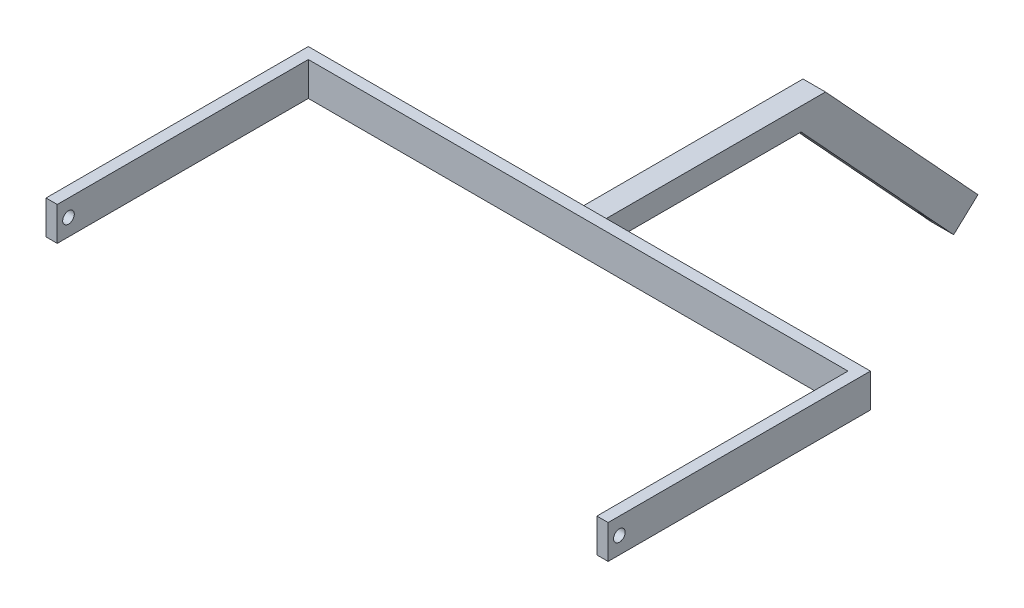
ISO-10303-21;
HEADER;
FILE_DESCRIPTION(('STEP AP214'),'2;1');
FILE_NAME('part.step','',(''),(''),'','','');
FILE_SCHEMA(('AUTOMOTIVE_DESIGN { 1 0 10303 214 1 1 1 1 }'));
ENDSEC;
DATA;
#1=APPLICATION_CONTEXT('core data for automotive mechanical design processes');
#2=APPLICATION_PROTOCOL_DEFINITION('international standard','automotive_design',2000,#1);
#3=PRODUCT_CONTEXT('',#1,'mechanical');
#4=PRODUCT('Part','Part','',(#3));
#5=PRODUCT_RELATED_PRODUCT_CATEGORY('part','',(#4));
#6=PRODUCT_DEFINITION_FORMATION('','',#4);
#7=PRODUCT_DEFINITION_CONTEXT('part definition',#1,'design');
#8=PRODUCT_DEFINITION('design','',#6,#7);
#9=PRODUCT_DEFINITION_SHAPE('','',#8);
#10=(LENGTH_UNIT() NAMED_UNIT(*) SI_UNIT(.MILLI.,.METRE.));
#11=(NAMED_UNIT(*) PLANE_ANGLE_UNIT() SI_UNIT($,.RADIAN.));
#12=(NAMED_UNIT(*) SI_UNIT($,.STERADIAN.) SOLID_ANGLE_UNIT());
#13=UNCERTAINTY_MEASURE_WITH_UNIT(LENGTH_MEASURE(1.E-05),#10,'distance_accuracy_value','');
#14=(GEOMETRIC_REPRESENTATION_CONTEXT(3) GLOBAL_UNCERTAINTY_ASSIGNED_CONTEXT((#13)) GLOBAL_UNIT_ASSIGNED_CONTEXT((#10,
#11,#12)) REPRESENTATION_CONTEXT('',''));
#15=CARTESIAN_POINT('',(0.,0.,0.));
#16=DIRECTION('',(0.,0.,1.));
#17=DIRECTION('',(1.,0.,0.));
#18=AXIS2_PLACEMENT_3D('',#15,#16,#17);
#19=CARTESIAN_POINT('',(0.,6.,-1.51515151515151));
#20=DIRECTION('',(0.,0.,1.));
#21=DIRECTION('',(1.,0.,0.));
#22=AXIS2_PLACEMENT_3D('',#19,#20,#21);
#23=PLANE('',#22);
#24=DIRECTION('',(0.,-1.,0.));
#25=VECTOR('',#24,1.);
#26=CARTESIAN_POINT('',(74.2424242424239,6.,-1.51515151515152));
#27=LINE('',#26,#25);
#28=CARTESIAN_POINT('',(74.2424242424239,7.5,-1.51515151515152));
#29=VERTEX_POINT('',#28);
#30=CARTESIAN_POINT('',(74.2424242424239,-1.5,-1.51515151515152));
#31=VERTEX_POINT('',#30);
#32=EDGE_CURVE('E314',#29,#31,#27,.T.);
#33=ORIENTED_EDGE('',*,*,#32,.T.);
#34=DIRECTION('',(1.,0.,0.));
#35=VECTOR('',#34,1.);
#36=CARTESIAN_POINT('',(-75.7575757575761,-1.5,-1.5151515151515));
#37=LINE('',#36,#35);
#38=CARTESIAN_POINT('',(-75.7575757575761,-1.5,-1.5151515151515));
#39=VERTEX_POINT('',#38);
#40=EDGE_CURVE('E252',#39,#31,#37,.T.);
#41=ORIENTED_EDGE('',*,*,#40,.F.);
#42=DIRECTION('',(0.,-1.,0.));
#43=VECTOR('',#42,1.);
#44=CARTESIAN_POINT('',(-75.7575757575761,6.,-1.5151515151515));
#45=LINE('',#44,#43);
#46=CARTESIAN_POINT('',(-75.7575757575761,7.5,-1.5151515151515));
#47=VERTEX_POINT('',#46);
#48=EDGE_CURVE('E312',#47,#39,#45,.T.);
#49=ORIENTED_EDGE('',*,*,#48,.F.);
#50=DIRECTION('',(-1.,0.,0.));
#51=VECTOR('',#50,1.);
#52=CARTESIAN_POINT('',(-75.7575757575761,7.5,-1.5151515151515));
#53=LINE('',#52,#51);
#54=EDGE_CURVE('E291',#29,#47,#53,.T.);
#55=ORIENTED_EDGE('',*,*,#54,.F.);
#56=EDGE_LOOP('',(#33,#41,#49,#55));
#57=FACE_BOUND('',#56,.T.);
#58=DIRECTION('',(0.,1.,0.));
#59=VECTOR('',#58,1.);
#60=CARTESIAN_POINT('',(-3.7575757575761,0.,-1.51515151515151));
#61=LINE('',#60,#59);
#62=CARTESIAN_POINT('',(-3.7575757575761,0.,-1.51515151515151));
#63=VERTEX_POINT('',#62);
#64=CARTESIAN_POINT('',(-3.7575757575761,6.,-1.51515151515151));
#65=VERTEX_POINT('',#64);
#66=EDGE_CURVE('E225',#63,#65,#61,.T.);
#67=ORIENTED_EDGE('',*,*,#66,.F.);
#68=DIRECTION('',(1.,0.,0.));
#69=VECTOR('',#68,1.);
#70=CARTESIAN_POINT('',(-3.7575757575761,0.,-1.51515151515151));
#71=LINE('',#70,#69);
#72=CARTESIAN_POINT('',(2.2424242424239,0.,-1.51515151515151));
#73=VERTEX_POINT('',#72);
#74=EDGE_CURVE('E229',#63,#73,#71,.T.);
#75=ORIENTED_EDGE('',*,*,#74,.T.);
#76=DIRECTION('',(0.,1.,0.));
#77=VECTOR('',#76,1.);
#78=CARTESIAN_POINT('',(2.2424242424239,0.,-1.51515151515151));
#79=LINE('',#78,#77);
#80=CARTESIAN_POINT('',(2.2424242424239,6.,-1.51515151515151));
#81=VERTEX_POINT('',#80);
#82=EDGE_CURVE('E235',#73,#81,#79,.T.);
#83=ORIENTED_EDGE('',*,*,#82,.T.);
#84=DIRECTION('',(1.,0.,0.));
#85=VECTOR('',#84,1.);
#86=CARTESIAN_POINT('',(-3.7575757575761,6.,-1.51515151515151));
#87=LINE('',#86,#85);
#88=EDGE_CURVE('E232',#65,#81,#87,.T.);
#89=ORIENTED_EDGE('',*,*,#88,.F.);
#90=EDGE_LOOP('',(#67,#75,#83,#89));
#91=FACE_BOUND('',#90,.T.);
#92=ADVANCED_FACE('F36',(#57,#91),#23,.F.);
#93=CARTESIAN_POINT('',(0.,6.,1.48484848484847));
#94=DIRECTION('',(0.,0.,1.));
#95=DIRECTION('',(1.,0.,0.));
#96=AXIS2_PLACEMENT_3D('',#93,#94,#95);
#97=PLANE('',#96);
#98=DIRECTION('',(0.,-1.,0.));
#99=VECTOR('',#98,1.);
#100=CARTESIAN_POINT('',(-72.7575757575761,6.,1.48484848484851));
#101=LINE('',#100,#99);
#102=CARTESIAN_POINT('',(-72.7575757575761,7.5,1.48484848484851));
#103=VERTEX_POINT('',#102);
#104=CARTESIAN_POINT('',(-72.7575757575761,-1.5,1.48484848484851));
#105=VERTEX_POINT('',#104);
#106=EDGE_CURVE('E306',#103,#105,#101,.T.);
#107=ORIENTED_EDGE('',*,*,#106,.T.);
#108=DIRECTION('',(-1.,0.,0.));
#109=VECTOR('',#108,1.);
#110=CARTESIAN_POINT('',(71.2424242424239,-1.5,1.48484848484846));
#111=LINE('',#110,#109);
#112=CARTESIAN_POINT('',(71.2424242424239,-1.5,1.48484848484846));
#113=VERTEX_POINT('',#112);
#114=EDGE_CURVE('E264',#113,#105,#111,.T.);
#115=ORIENTED_EDGE('',*,*,#114,.F.);
#116=DIRECTION('',(0.,-1.,0.));
#117=VECTOR('',#116,1.);
#118=CARTESIAN_POINT('',(71.2424242424239,6.,1.48484848484846));
#119=LINE('',#118,#117);
#120=CARTESIAN_POINT('',(71.2424242424239,7.5,1.48484848484846));
#121=VERTEX_POINT('',#120);
#122=EDGE_CURVE('E11',#121,#113,#119,.T.);
#123=ORIENTED_EDGE('',*,*,#122,.F.);
#124=DIRECTION('',(1.,0.,0.));
#125=VECTOR('',#124,1.);
#126=CARTESIAN_POINT('',(71.2424242424239,7.5,1.48484848484846));
#127=LINE('',#126,#125);
#128=EDGE_CURVE('E279',#103,#121,#127,.T.);
#129=ORIENTED_EDGE('',*,*,#128,.F.);
#130=EDGE_LOOP('',(#107,#115,#123,#129));
#131=FACE_BOUND('',#130,.T.);
#132=ADVANCED_FACE('F38',(#131),#97,.T.);
#133=CARTESIAN_POINT('',(71.2424242424239,6.,0.));
#134=DIRECTION('',(1.,0.,0.));
#135=DIRECTION('',(0.,0.,-1.));
#136=AXIS2_PLACEMENT_3D('',#133,#134,#135);
#137=PLANE('',#136);
#138=CARTESIAN_POINT('',(71.2424242424239,3.,65.4848484848485));
#139=DIRECTION('',(1.,0.,0.));
#140=DIRECTION('',(0.,0.,-1.));
#141=AXIS2_PLACEMENT_3D('',#138,#139,#140);
#142=CIRCLE('',#141,1.54999999999999);
#143=CARTESIAN_POINT('',(71.2424242424239,3.,63.9348484848485));
#144=VERTEX_POINT('',#143);
#145=EDGE_CURVE('E297',#144,#144,#142,.T.);
#146=ORIENTED_EDGE('',*,*,#145,.T.);
#147=EDGE_LOOP('',(#146));
#148=FACE_BOUND('',#147,.T.);
#149=ORIENTED_EDGE('',*,*,#122,.T.);
#150=DIRECTION('',(0.,0.,-1.));
#151=VECTOR('',#150,1.);
#152=CARTESIAN_POINT('',(71.2424242424239,-1.5,68.4848484848485));
#153=LINE('',#152,#151);
#154=CARTESIAN_POINT('',(71.2424242424239,-1.5,68.4848484848485));
#155=VERTEX_POINT('',#154);
#156=EDGE_CURVE('E261',#155,#113,#153,.T.);
#157=ORIENTED_EDGE('',*,*,#156,.F.);
#158=DIRECTION('',(0.,-1.,0.));
#159=VECTOR('',#158,1.);
#160=CARTESIAN_POINT('',(71.2424242424239,6.,68.4848484848485));
#161=LINE('',#160,#159);
#162=CARTESIAN_POINT('',(71.2424242424239,7.5,68.4848484848485));
#163=VERTEX_POINT('',#162);
#164=EDGE_CURVE('E45',#163,#155,#161,.T.);
#165=ORIENTED_EDGE('',*,*,#164,.F.);
#166=DIRECTION('',(0.,0.,1.));
#167=VECTOR('',#166,1.);
#168=CARTESIAN_POINT('',(71.2424242424239,7.5,68.4848484848485));
#169=LINE('',#168,#167);
#170=EDGE_CURVE('E282',#121,#163,#169,.T.);
#171=ORIENTED_EDGE('',*,*,#170,.F.);
#172=EDGE_LOOP('',(#149,#157,#165,#171));
#173=FACE_BOUND('',#172,.T.);
#174=ADVANCED_FACE('F329',(#148,#173),#137,.F.);
#175=CARTESIAN_POINT('',(0.,6.,68.4848484848485));
#176=DIRECTION('',(0.,0.,1.));
#177=DIRECTION('',(1.,0.,0.));
#178=AXIS2_PLACEMENT_3D('',#175,#176,#177);
#179=PLANE('',#178);
#180=ORIENTED_EDGE('',*,*,#164,.T.);
#181=DIRECTION('',(-1.,0.,0.));
#182=VECTOR('',#181,1.);
#183=CARTESIAN_POINT('',(74.2424242424239,-1.5,68.4848484848485));
#184=LINE('',#183,#182);
#185=CARTESIAN_POINT('',(74.2424242424239,-1.5,68.4848484848485));
#186=VERTEX_POINT('',#185);
#187=EDGE_CURVE('E258',#186,#155,#184,.T.);
#188=ORIENTED_EDGE('',*,*,#187,.F.);
#189=DIRECTION('',(0.,-1.,0.));
#190=VECTOR('',#189,1.);
#191=CARTESIAN_POINT('',(74.2424242424239,6.,68.4848484848485));
#192=LINE('',#191,#190);
#193=CARTESIAN_POINT('',(74.2424242424239,7.5,68.4848484848485));
#194=VERTEX_POINT('',#193);
#195=EDGE_CURVE('E316',#194,#186,#192,.T.);
#196=ORIENTED_EDGE('',*,*,#195,.F.);
#197=DIRECTION('',(1.,0.,0.));
#198=VECTOR('',#197,1.);
#199=CARTESIAN_POINT('',(74.2424242424239,7.5,68.4848484848485));
#200=LINE('',#199,#198);
#201=EDGE_CURVE('E285',#163,#194,#200,.T.);
#202=ORIENTED_EDGE('',*,*,#201,.F.);
#203=EDGE_LOOP('',(#180,#188,#196,#202));
#204=FACE_BOUND('',#203,.T.);
#205=ADVANCED_FACE('F321',(#204),#179,.T.);
#206=CARTESIAN_POINT('',(74.2424242424239,6.,0.));
#207=DIRECTION('',(1.,0.,0.));
#208=DIRECTION('',(0.,0.,-1.));
#209=AXIS2_PLACEMENT_3D('',#206,#207,#208);
#210=PLANE('',#209);
#211=CARTESIAN_POINT('',(74.2424242424239,3.,65.4848484848485));
#212=DIRECTION('',(1.,0.,0.));
#213=DIRECTION('',(0.,0.,-1.));
#214=AXIS2_PLACEMENT_3D('',#211,#212,#213);
#215=CIRCLE('',#214,1.54999999999999);
#216=CARTESIAN_POINT('',(74.2424242424239,3.,63.9348484848485));
#217=VERTEX_POINT('',#216);
#218=EDGE_CURVE('E294',#217,#217,#215,.T.);
#219=ORIENTED_EDGE('',*,*,#218,.F.);
#220=EDGE_LOOP('',(#219));
#221=FACE_BOUND('',#220,.T.);
#222=ORIENTED_EDGE('',*,*,#195,.T.);
#223=DIRECTION('',(0.,0.,1.));
#224=VECTOR('',#223,1.);
#225=CARTESIAN_POINT('',(74.2424242424239,-1.5,-1.51515151515152));
#226=LINE('',#225,#224);
#227=EDGE_CURVE('E255',#31,#186,#226,.T.);
#228=ORIENTED_EDGE('',*,*,#227,.F.);
#229=ORIENTED_EDGE('',*,*,#32,.F.);
#230=DIRECTION('',(0.,0.,-1.));
#231=VECTOR('',#230,1.);
#232=CARTESIAN_POINT('',(74.2424242424239,7.5,-1.51515151515152));
#233=LINE('',#232,#231);
#234=EDGE_CURVE('E288',#194,#29,#233,.T.);
#235=ORIENTED_EDGE('',*,*,#234,.F.);
#236=EDGE_LOOP('',(#222,#228,#229,#235));
#237=FACE_BOUND('',#236,.T.);
#238=ADVANCED_FACE('F352',(#221,#237),#210,.T.);
#239=CARTESIAN_POINT('',(-75.7575757575761,6.,0.));
#240=DIRECTION('',(-1.,0.,0.));
#241=DIRECTION('',(0.,0.,1.));
#242=AXIS2_PLACEMENT_3D('',#239,#240,#241);
#243=PLANE('',#242);
#244=CARTESIAN_POINT('',(-75.7575757575761,3.,65.4848484848485));
#245=DIRECTION('',(-1.,0.,0.));
#246=DIRECTION('',(0.,0.,1.));
#247=AXIS2_PLACEMENT_3D('',#244,#245,#246);
#248=CIRCLE('',#247,1.54999999999999);
#249=CARTESIAN_POINT('',(-75.7575757575761,3.,67.0348484848485));
#250=VERTEX_POINT('',#249);
#251=EDGE_CURVE('E303',#250,#250,#248,.T.);
#252=ORIENTED_EDGE('',*,*,#251,.F.);
#253=EDGE_LOOP('',(#252));
#254=FACE_BOUND('',#253,.T.);
#255=ORIENTED_EDGE('',*,*,#48,.T.);
#256=DIRECTION('',(0.,0.,-1.));
#257=VECTOR('',#256,1.);
#258=CARTESIAN_POINT('',(-75.7575757575761,-1.5,68.4848484848485));
#259=LINE('',#258,#257);
#260=CARTESIAN_POINT('',(-75.7575757575761,-1.5,68.4848484848485));
#261=VERTEX_POINT('',#260);
#262=EDGE_CURVE('E249',#261,#39,#259,.T.);
#263=ORIENTED_EDGE('',*,*,#262,.F.);
#264=DIRECTION('',(0.,-1.,0.));
#265=VECTOR('',#264,1.);
#266=CARTESIAN_POINT('',(-75.7575757575761,6.,68.4848484848485));
#267=LINE('',#266,#265);
#268=CARTESIAN_POINT('',(-75.7575757575761,7.5,68.4848484848485));
#269=VERTEX_POINT('',#268);
#270=EDGE_CURVE('E310',#269,#261,#267,.T.);
#271=ORIENTED_EDGE('',*,*,#270,.F.);
#272=DIRECTION('',(0.,0.,1.));
#273=VECTOR('',#272,1.);
#274=CARTESIAN_POINT('',(-75.7575757575761,7.5,68.4848484848485));
#275=LINE('',#274,#273);
#276=EDGE_CURVE('E270',#47,#269,#275,.T.);
#277=ORIENTED_EDGE('',*,*,#276,.F.);
#278=EDGE_LOOP('',(#255,#263,#271,#277));
#279=FACE_BOUND('',#278,.T.);
#280=ADVANCED_FACE('F345',(#254,#279),#243,.T.);
#281=CARTESIAN_POINT('',(-3.16806065107685E-13,6.,68.4848484848488));
#282=DIRECTION('',(0.,0.,-1.));
#283=DIRECTION('',(-1.,0.,0.));
#284=AXIS2_PLACEMENT_3D('',#281,#282,#283);
#285=PLANE('',#284);
#286=ORIENTED_EDGE('',*,*,#270,.T.);
#287=DIRECTION('',(-1.,0.,0.));
#288=VECTOR('',#287,1.);
#289=CARTESIAN_POINT('',(-72.7575757575761,-1.5,68.4848484848485));
#290=LINE('',#289,#288);
#291=CARTESIAN_POINT('',(-72.7575757575761,-1.5,68.4848484848485));
#292=VERTEX_POINT('',#291);
#293=EDGE_CURVE('E246',#292,#261,#290,.T.);
#294=ORIENTED_EDGE('',*,*,#293,.F.);
#295=DIRECTION('',(0.,-1.,0.));
#296=VECTOR('',#295,1.);
#297=CARTESIAN_POINT('',(-72.7575757575761,6.,68.4848484848485));
#298=LINE('',#297,#296);
#299=CARTESIAN_POINT('',(-72.7575757575761,7.5,68.4848484848485));
#300=VERTEX_POINT('',#299);
#301=EDGE_CURVE('E308',#300,#292,#298,.T.);
#302=ORIENTED_EDGE('',*,*,#301,.F.);
#303=DIRECTION('',(1.,0.,0.));
#304=VECTOR('',#303,1.);
#305=CARTESIAN_POINT('',(-72.7575757575761,7.5,68.4848484848485));
#306=LINE('',#305,#304);
#307=EDGE_CURVE('E273',#269,#300,#306,.T.);
#308=ORIENTED_EDGE('',*,*,#307,.F.);
#309=EDGE_LOOP('',(#286,#294,#302,#308));
#310=FACE_BOUND('',#309,.T.);
#311=ADVANCED_FACE('F341',(#310),#285,.F.);
#312=CARTESIAN_POINT('',(-72.7575757575761,6.,0.));
#313=DIRECTION('',(1.,0.,0.));
#314=DIRECTION('',(0.,0.,-1.));
#315=AXIS2_PLACEMENT_3D('',#312,#313,#314);
#316=PLANE('',#315);
#317=CARTESIAN_POINT('',(-72.7575757575761,3.,65.4848484848485));
#318=DIRECTION('',(1.,0.,0.));
#319=DIRECTION('',(0.,0.,-1.));
#320=AXIS2_PLACEMENT_3D('',#317,#318,#319);
#321=CIRCLE('',#320,1.54999999999999);
#322=CARTESIAN_POINT('',(-72.7575757575761,3.,63.9348484848485));
#323=VERTEX_POINT('',#322);
#324=EDGE_CURVE('E300',#323,#323,#321,.T.);
#325=ORIENTED_EDGE('',*,*,#324,.F.);
#326=EDGE_LOOP('',(#325));
#327=FACE_BOUND('',#326,.T.);
#328=ORIENTED_EDGE('',*,*,#301,.T.);
#329=DIRECTION('',(0.,0.,1.));
#330=VECTOR('',#329,1.);
#331=CARTESIAN_POINT('',(-72.7575757575761,-1.5,1.48484848484851));
#332=LINE('',#331,#330);
#333=EDGE_CURVE('E267',#105,#292,#332,.T.);
#334=ORIENTED_EDGE('',*,*,#333,.F.);
#335=ORIENTED_EDGE('',*,*,#106,.F.);
#336=DIRECTION('',(0.,0.,-1.));
#337=VECTOR('',#336,1.);
#338=CARTESIAN_POINT('',(-72.7575757575761,7.5,1.48484848484851));
#339=LINE('',#338,#337);
#340=EDGE_CURVE('E276',#300,#103,#339,.T.);
#341=ORIENTED_EDGE('',*,*,#340,.F.);
#342=EDGE_LOOP('',(#328,#334,#335,#341));
#343=FACE_BOUND('',#342,.T.);
#344=ADVANCED_FACE('F337',(#327,#343),#316,.T.);
#345=CARTESIAN_POINT('',(-82.7575757575761,3.,65.4848484848485));
#346=DIRECTION('',(1.,0.,0.));
#347=DIRECTION('',(0.,0.,-1.));
#348=AXIS2_PLACEMENT_3D('',#345,#346,#347);
#349=CYLINDRICAL_SURFACE('',#348,1.54999999999999);
#350=ORIENTED_EDGE('',*,*,#251,.T.);
#351=EDGE_LOOP('',(#350));
#352=FACE_BOUND('',#351,.T.);
#353=ORIENTED_EDGE('',*,*,#324,.T.);
#354=EDGE_LOOP('',(#353));
#355=FACE_BOUND('',#354,.T.);
#356=ADVANCED_FACE('F374',(#352,#355),#349,.F.);
#357=CARTESIAN_POINT('',(64.2424242424239,3.,65.4848484848485));
#358=DIRECTION('',(1.,0.,0.));
#359=DIRECTION('',(0.,0.,-1.));
#360=AXIS2_PLACEMENT_3D('',#357,#358,#359);
#361=CYLINDRICAL_SURFACE('',#360,1.54999999999999);
#362=ORIENTED_EDGE('',*,*,#218,.T.);
#363=EDGE_LOOP('',(#362));
#364=FACE_BOUND('',#363,.T.);
#365=ORIENTED_EDGE('',*,*,#145,.F.);
#366=EDGE_LOOP('',(#365));
#367=FACE_BOUND('',#366,.T.);
#368=ADVANCED_FACE('F378',(#364,#367),#361,.F.);
#369=CARTESIAN_POINT('',(0.,7.5,0.));
#370=DIRECTION('',(0.,-1.,0.));
#371=DIRECTION('',(0.,0.,-1.));
#372=AXIS2_PLACEMENT_3D('',#369,#370,#371);
#373=PLANE('',#372);
#374=ORIENTED_EDGE('',*,*,#276,.T.);
#375=ORIENTED_EDGE('',*,*,#307,.T.);
#376=ORIENTED_EDGE('',*,*,#340,.T.);
#377=ORIENTED_EDGE('',*,*,#128,.T.);
#378=ORIENTED_EDGE('',*,*,#170,.T.);
#379=ORIENTED_EDGE('',*,*,#201,.T.);
#380=ORIENTED_EDGE('',*,*,#234,.T.);
#381=ORIENTED_EDGE('',*,*,#54,.T.);
#382=EDGE_LOOP('',(#374,#375,#376,#377,#378,#379,#380,#381));
#383=FACE_BOUND('',#382,.T.);
#384=ADVANCED_FACE('F333',(#383),#373,.F.);
#385=CARTESIAN_POINT('',(0.,-1.5,0.));
#386=DIRECTION('',(0.,-1.,0.));
#387=DIRECTION('',(0.,0.,-1.));
#388=AXIS2_PLACEMENT_3D('',#385,#386,#387);
#389=PLANE('',#388);
#390=ORIENTED_EDGE('',*,*,#293,.T.);
#391=ORIENTED_EDGE('',*,*,#262,.T.);
#392=ORIENTED_EDGE('',*,*,#40,.T.);
#393=ORIENTED_EDGE('',*,*,#227,.T.);
#394=ORIENTED_EDGE('',*,*,#187,.T.);
#395=ORIENTED_EDGE('',*,*,#156,.T.);
#396=ORIENTED_EDGE('',*,*,#114,.T.);
#397=ORIENTED_EDGE('',*,*,#333,.T.);
#398=EDGE_LOOP('',(#390,#391,#392,#393,#394,#395,#396,#397));
#399=FACE_BOUND('',#398,.T.);
#400=ADVANCED_FACE('F326',(#399),#389,.T.);
#401=CARTESIAN_POINT('',(-3.7575757575761,0.,-61.5151515151515));
#402=DIRECTION('',(1.,0.,0.));
#403=DIRECTION('',(0.,0.,-1.));
#404=AXIS2_PLACEMENT_3D('',#401,#402,#403);
#405=PLANE('',#404);
#406=DIRECTION('',(0.,0.,1.));
#407=VECTOR('',#406,1.);
#408=CARTESIAN_POINT('',(-3.7575757575761,6.,-61.5151515151515));
#409=LINE('',#408,#407);
#410=CARTESIAN_POINT('',(-3.7575757575761,5.99999999999999,-61.5151515151515));
#411=VERTEX_POINT('',#410);
#412=EDGE_CURVE('E244',#411,#65,#409,.T.);
#413=ORIENTED_EDGE('',*,*,#412,.F.);
#414=DIRECTION('',(0.,0.734803444627488,0.678280102733066));
#415=VECTOR('',#414,1.);
#416=CARTESIAN_POINT('',(-3.75757575757611,-38.0882066776493,-102.211957679135));
#417=LINE('',#416,#415);
#418=CARTESIAN_POINT('',(-3.75757575757611,-38.0882066776493,-102.211957679135));
#419=VERTEX_POINT('',#418);
#420=EDGE_CURVE('E218',#419,#411,#417,.T.);
#421=ORIENTED_EDGE('',*,*,#420,.F.);
#422=DIRECTION('',(0.,0.678280102733066,-0.734803444627488));
#423=VECTOR('',#422,1.);
#424=CARTESIAN_POINT('',(-3.75757575757611,-44.0882066776493,-95.7119576791355));
#425=LINE('',#424,#423);
#426=CARTESIAN_POINT('',(-3.75757575757611,-44.0882066776493,-95.7119576791355));
#427=VERTEX_POINT('',#426);
#428=EDGE_CURVE('E207',#427,#419,#425,.T.);
#429=ORIENTED_EDGE('',*,*,#428,.F.);
#430=DIRECTION('',(0.,0.734803444627488,0.678280102733066));
#431=VECTOR('',#430,1.);
#432=CARTESIAN_POINT('',(-3.75757575757611,-44.0882066776493,-95.7119576791355));
#433=LINE('',#432,#431);
#434=CARTESIAN_POINT('',(-3.75757575757611,0.,-55.0151515151515));
#435=VERTEX_POINT('',#434);
#436=EDGE_CURVE('E220',#427,#435,#433,.T.);
#437=ORIENTED_EDGE('',*,*,#436,.T.);
#438=DIRECTION('',(0.,0.,1.));
#439=VECTOR('',#438,1.);
#440=CARTESIAN_POINT('',(-3.7575757575761,0.,-61.5151515151515));
#441=LINE('',#440,#439);
#442=EDGE_CURVE('E228',#435,#63,#441,.T.);
#443=ORIENTED_EDGE('',*,*,#442,.T.);
#444=ORIENTED_EDGE('',*,*,#66,.T.);
#445=EDGE_LOOP('',(#413,#421,#429,#437,#443,#444));
#446=FACE_BOUND('',#445,.T.);
#447=ADVANCED_FACE('F387',(#446),#405,.F.);
#448=CARTESIAN_POINT('',(-3.7575757575761,6.,-61.5151515151515));
#449=DIRECTION('',(0.,-1.,0.));
#450=DIRECTION('',(1.,0.,0.));
#451=AXIS2_PLACEMENT_3D('',#448,#449,#450);
#452=PLANE('',#451);
#453=ORIENTED_EDGE('',*,*,#88,.T.);
#454=DIRECTION('',(0.,0.,1.));
#455=VECTOR('',#454,1.);
#456=CARTESIAN_POINT('',(2.2424242424239,6.,-61.5151515151515));
#457=LINE('',#456,#455);
#458=CARTESIAN_POINT('',(2.2424242424239,5.99999999999999,-61.5151515151515));
#459=VERTEX_POINT('',#458);
#460=EDGE_CURVE('E242',#459,#81,#457,.T.);
#461=ORIENTED_EDGE('',*,*,#460,.F.);
#462=DIRECTION('',(1.,0.,0.));
#463=VECTOR('',#462,1.);
#464=CARTESIAN_POINT('',(-3.7575757575761,6.,-61.5151515151515));
#465=LINE('',#464,#463);
#466=EDGE_CURVE('E226',#411,#459,#465,.T.);
#467=ORIENTED_EDGE('',*,*,#466,.F.);
#468=ORIENTED_EDGE('',*,*,#412,.T.);
#469=EDGE_LOOP('',(#453,#461,#467,#468));
#470=FACE_BOUND('',#469,.T.);
#471=ADVANCED_FACE('F390',(#470),#452,.F.);
#472=CARTESIAN_POINT('',(2.2424242424239,0.,-61.5151515151515));
#473=DIRECTION('',(1.,0.,0.));
#474=DIRECTION('',(0.,0.,-1.));
#475=AXIS2_PLACEMENT_3D('',#472,#473,#474);
#476=PLANE('',#475);
#477=DIRECTION('',(0.,0.,1.));
#478=VECTOR('',#477,1.);
#479=CARTESIAN_POINT('',(2.2424242424239,0.,-61.5151515151515));
#480=LINE('',#479,#478);
#481=CARTESIAN_POINT('',(2.2424242424239,0.,-55.0151515151515));
#482=VERTEX_POINT('',#481);
#483=EDGE_CURVE('E60',#482,#73,#480,.T.);
#484=ORIENTED_EDGE('',*,*,#483,.F.);
#485=DIRECTION('',(0.,0.734803444627488,0.678280102733066));
#486=VECTOR('',#485,1.);
#487=CARTESIAN_POINT('',(2.24242424242389,-44.0882066776493,-95.7119576791355));
#488=LINE('',#487,#486);
#489=CARTESIAN_POINT('',(2.24242424242389,-44.0882066776493,-95.7119576791355));
#490=VERTEX_POINT('',#489);
#491=EDGE_CURVE('E213',#490,#482,#488,.T.);
#492=ORIENTED_EDGE('',*,*,#491,.F.);
#493=DIRECTION('',(0.,-0.678280102733066,0.734803444627488));
#494=VECTOR('',#493,1.);
#495=CARTESIAN_POINT('',(2.24242424242389,-38.0882066776493,-102.211957679135));
#496=LINE('',#495,#494);
#497=CARTESIAN_POINT('',(2.24242424242389,-38.0882066776493,-102.211957679135));
#498=VERTEX_POINT('',#497);
#499=EDGE_CURVE('E211',#498,#490,#496,.T.);
#500=ORIENTED_EDGE('',*,*,#499,.F.);
#501=DIRECTION('',(0.,0.734803444627488,0.678280102733066));
#502=VECTOR('',#501,1.);
#503=CARTESIAN_POINT('',(2.24242424242389,-38.0882066776493,-102.211957679135));
#504=LINE('',#503,#502);
#505=EDGE_CURVE('E215',#498,#459,#504,.T.);
#506=ORIENTED_EDGE('',*,*,#505,.T.);
#507=ORIENTED_EDGE('',*,*,#460,.T.);
#508=ORIENTED_EDGE('',*,*,#82,.F.);
#509=EDGE_LOOP('',(#484,#492,#500,#506,#507,#508));
#510=FACE_BOUND('',#509,.T.);
#511=ADVANCED_FACE('F394',(#510),#476,.T.);
#512=CARTESIAN_POINT('',(-3.7575757575761,0.,-61.5151515151515));
#513=DIRECTION('',(0.,-1.,0.));
#514=DIRECTION('',(1.,0.,0.));
#515=AXIS2_PLACEMENT_3D('',#512,#513,#514);
#516=PLANE('',#515);
#517=DIRECTION('',(1.,0.,0.));
#518=VECTOR('',#517,1.);
#519=CARTESIAN_POINT('',(-57.7575757575761,0.,-55.0151515151515));
#520=LINE('',#519,#518);
#521=EDGE_CURVE('E223',#435,#482,#520,.T.);
#522=ORIENTED_EDGE('',*,*,#521,.T.);
#523=ORIENTED_EDGE('',*,*,#483,.T.);
#524=ORIENTED_EDGE('',*,*,#74,.F.);
#525=ORIENTED_EDGE('',*,*,#442,.F.);
#526=EDGE_LOOP('',(#522,#523,#524,#525));
#527=FACE_BOUND('',#526,.T.);
#528=ADVANCED_FACE('F398',(#527),#516,.T.);
#529=CARTESIAN_POINT('',(2.24242424242389,-44.0882066776493,-95.7119576791355));
#530=DIRECTION('',(0.,0.678280102733066,-0.734803444627488));
#531=DIRECTION('',(0.,0.734803444627488,0.678280102733066));
#532=AXIS2_PLACEMENT_3D('',#529,#530,#531);
#533=PLANE('',#532);
#534=CARTESIAN_POINT('',(-0.757575757576109,-38.9445825652569,-90.963996960004));
#535=DIRECTION('',(0.,0.678280102733066,-0.734803444627488));
#536=DIRECTION('',(0.,0.734803444627488,0.678280102733066));
#537=AXIS2_PLACEMENT_3D('',#534,#535,#536);
#538=CIRCLE('',#537,1.55);
#539=CARTESIAN_POINT('',(-0.757575757576109,-37.8056372260843,-89.9126628007678));
#540=VERTEX_POINT('',#539);
#541=EDGE_CURVE('E189',#540,#540,#538,.T.);
#542=ORIENTED_EDGE('',*,*,#541,.T.);
#543=EDGE_LOOP('',(#542));
#544=FACE_BOUND('',#543,.T.);
#545=ORIENTED_EDGE('',*,*,#521,.F.);
#546=ORIENTED_EDGE('',*,*,#436,.F.);
#547=DIRECTION('',(-1.,0.,0.));
#548=VECTOR('',#547,1.);
#549=CARTESIAN_POINT('',(2.24242424242389,-44.0882066776493,-95.7119576791355));
#550=LINE('',#549,#548);
#551=EDGE_CURVE('E201',#490,#427,#550,.T.);
#552=ORIENTED_EDGE('',*,*,#551,.F.);
#553=ORIENTED_EDGE('',*,*,#491,.T.);
#554=EDGE_LOOP('',(#545,#546,#552,#553));
#555=FACE_BOUND('',#554,.T.);
#556=ADVANCED_FACE('F402',(#544,#555),#533,.F.);
#557=CARTESIAN_POINT('',(-3.75757575757611,-38.0882066776493,-102.211957679135));
#558=DIRECTION('',(0.,-0.678280102733066,0.734803444627488));
#559=DIRECTION('',(0.,-0.734803444627488,-0.678280102733066));
#560=AXIS2_PLACEMENT_3D('',#557,#558,#559);
#561=PLANE('',#560);
#562=CARTESIAN_POINT('',(-0.757575757576109,-32.9445825652569,-97.463996960004));
#563=DIRECTION('',(0.,0.678280102733066,-0.734803444627488));
#564=DIRECTION('',(0.,0.734803444627488,0.678280102733066));
#565=AXIS2_PLACEMENT_3D('',#562,#563,#564);
#566=CIRCLE('',#565,1.55);
#567=CARTESIAN_POINT('',(-0.757575757576109,-31.8056372260842,-96.4126628007678));
#568=VERTEX_POINT('',#567);
#569=EDGE_CURVE('E444',#568,#568,#566,.T.);
#570=ORIENTED_EDGE('',*,*,#569,.F.);
#571=EDGE_LOOP('',(#570));
#572=FACE_BOUND('',#571,.T.);
#573=ORIENTED_EDGE('',*,*,#466,.T.);
#574=ORIENTED_EDGE('',*,*,#505,.F.);
#575=DIRECTION('',(1.,0.,0.));
#576=VECTOR('',#575,1.);
#577=CARTESIAN_POINT('',(-3.75757575757611,-38.0882066776493,-102.211957679135));
#578=LINE('',#577,#576);
#579=EDGE_CURVE('E209',#419,#498,#578,.T.);
#580=ORIENTED_EDGE('',*,*,#579,.F.);
#581=ORIENTED_EDGE('',*,*,#420,.T.);
#582=EDGE_LOOP('',(#573,#574,#580,#581));
#583=FACE_BOUND('',#582,.T.);
#584=ADVANCED_FACE('F405',(#572,#583),#561,.F.);
#585=CARTESIAN_POINT('',(0.,-71.5078988066066,-66.0072912060984));
#586=DIRECTION('',(0.,-0.734803444627488,-0.678280102733066));
#587=DIRECTION('',(0.,0.678280102733066,-0.734803444627488));
#588=AXIS2_PLACEMENT_3D('',#585,#586,#587);
#589=PLANE('',#588);
#590=DIRECTION('',(0.,0.678280102733068,-0.734803444627486));
#591=VECTOR('',#590,1.);
#592=CARTESIAN_POINT('',(-3.25757575757612,-40.4099265749162,-99.696761123763));
#593=LINE('',#592,#591);
#594=CARTESIAN_POINT('',(-3.25757575757612,-41.7664867803824,-98.227154234508));
#595=VERTEX_POINT('',#594);
#596=CARTESIAN_POINT('',(-3.25757575757612,-40.4099265749162,-99.696761123763));
#597=VERTEX_POINT('',#596);
#598=EDGE_CURVE('E52',#595,#597,#593,.T.);
#599=ORIENTED_EDGE('',*,*,#598,.F.);
#600=DIRECTION('',(-1.,0.,0.));
#601=VECTOR('',#600,1.);
#602=CARTESIAN_POINT('',(1.74242424242388,-41.7664867803824,-98.227154234508));
#603=LINE('',#602,#601);
#604=CARTESIAN_POINT('',(1.74242424242388,-41.7664867803824,-98.227154234508));
#605=VERTEX_POINT('',#604);
#606=EDGE_CURVE('E183',#605,#595,#603,.T.);
#607=ORIENTED_EDGE('',*,*,#606,.F.);
#608=DIRECTION('',(0.,-0.678280102733068,0.734803444627486));
#609=VECTOR('',#608,1.);
#610=CARTESIAN_POINT('',(1.74242424242388,-40.4099265749162,-99.696761123763));
#611=LINE('',#610,#609);
#612=CARTESIAN_POINT('',(1.74242424242388,-40.4099265749162,-99.696761123763));
#613=VERTEX_POINT('',#612);
#614=EDGE_CURVE('E186',#613,#605,#611,.T.);
#615=ORIENTED_EDGE('',*,*,#614,.F.);
#616=DIRECTION('',(1.,0.,0.));
#617=VECTOR('',#616,1.);
#618=CARTESIAN_POINT('',(1.74242424242388,-40.4099265749162,-99.696761123763));
#619=LINE('',#618,#617);
#620=EDGE_CURVE('E195',#597,#613,#619,.T.);
#621=ORIENTED_EDGE('',*,*,#620,.F.);
#622=EDGE_LOOP('',(#599,#607,#615,#621));
#623=FACE_BOUND('',#622,.T.);
#624=ORIENTED_EDGE('',*,*,#551,.T.);
#625=ORIENTED_EDGE('',*,*,#428,.T.);
#626=ORIENTED_EDGE('',*,*,#579,.T.);
#627=ORIENTED_EDGE('',*,*,#499,.T.);
#628=EDGE_LOOP('',(#624,#625,#626,#627));
#629=FACE_BOUND('',#628,.T.);
#630=ADVANCED_FACE('F409',(#623,#629),#589,.T.);
#631=CARTESIAN_POINT('',(-3.25757575757612,-33.0618921286413,-92.9139600964323));
#632=DIRECTION('',(-1.,0.,0.));
#633=DIRECTION('',(0.,0.,1.));
#634=AXIS2_PLACEMENT_3D('',#631,#632,#633);
#635=PLANE('',#634);
#636=ORIENTED_EDGE('',*,*,#598,.T.);
#637=DIRECTION('',(0.,-0.734803444627488,-0.678280102733066));
#638=VECTOR('',#637,1.);
#639=CARTESIAN_POINT('',(-3.25757575757612,-33.0618921286413,-92.9139600964323));
#640=LINE('',#639,#638);
#641=CARTESIAN_POINT('',(-3.25757575757612,-33.0618921286413,-92.9139600964323));
#642=VERTEX_POINT('',#641);
#643=EDGE_CURVE('E161',#642,#597,#640,.T.);
#644=ORIENTED_EDGE('',*,*,#643,.F.);
#645=DIRECTION('',(0.,0.678280102733068,-0.734803444627486));
#646=VECTOR('',#645,1.);
#647=CARTESIAN_POINT('',(-3.25757575757612,-33.0618921286413,-92.9139600964323));
#648=LINE('',#647,#646);
#649=CARTESIAN_POINT('',(-3.25757575757612,-34.4184523341075,-91.4443532071774));
#650=VERTEX_POINT('',#649);
#651=EDGE_CURVE('E165',#650,#642,#648,.T.);
#652=ORIENTED_EDGE('',*,*,#651,.F.);
#653=DIRECTION('',(0.,-0.734803444627488,-0.678280102733066));
#654=VECTOR('',#653,1.);
#655=CARTESIAN_POINT('',(-3.25757575757612,-34.4184523341075,-91.4443532071774));
#656=LINE('',#655,#654);
#657=EDGE_CURVE('E199',#650,#595,#656,.T.);
#658=ORIENTED_EDGE('',*,*,#657,.T.);
#659=EDGE_LOOP('',(#636,#644,#652,#658));
#660=FACE_BOUND('',#659,.T.);
#661=ADVANCED_FACE('F163',(#660),#635,.F.);
#662=CARTESIAN_POINT('',(1.74242424242388,-34.4184523341075,-91.4443532071774));
#663=DIRECTION('',(0.,-0.678280102733066,0.734803444627488));
#664=DIRECTION('',(0.,-0.734803444627488,-0.678280102733066));
#665=AXIS2_PLACEMENT_3D('',#662,#663,#664);
#666=PLANE('',#665);
#667=CARTESIAN_POINT('',(-0.757575757576109,-36.6228626679899,-93.4791935153765));
#668=DIRECTION('',(0.,-0.678280102733066,0.734803444627488));
#669=DIRECTION('',(0.,-0.734803444627488,-0.678280102733066));
#670=AXIS2_PLACEMENT_3D('',#667,#668,#669);
#671=CIRCLE('',#670,1.55);
#672=CARTESIAN_POINT('',(-0.757575757576109,-37.7618080071625,-94.5305276746128));
#673=VERTEX_POINT('',#672);
#674=EDGE_CURVE('E440',#673,#673,#671,.T.);
#675=ORIENTED_EDGE('',*,*,#674,.T.);
#676=EDGE_LOOP('',(#675));
#677=FACE_BOUND('',#676,.T.);
#678=ORIENTED_EDGE('',*,*,#606,.T.);
#679=ORIENTED_EDGE('',*,*,#657,.F.);
#680=DIRECTION('',(-1.,0.,0.));
#681=VECTOR('',#680,1.);
#682=CARTESIAN_POINT('',(1.74242424242388,-34.4184523341075,-91.4443532071774));
#683=LINE('',#682,#681);
#684=CARTESIAN_POINT('',(1.74242424242388,-34.4184523341075,-91.4443532071774));
#685=VERTEX_POINT('',#684);
#686=EDGE_CURVE('E171',#685,#650,#683,.T.);
#687=ORIENTED_EDGE('',*,*,#686,.F.);
#688=DIRECTION('',(0.,-0.734803444627488,-0.678280102733066));
#689=VECTOR('',#688,1.);
#690=CARTESIAN_POINT('',(1.74242424242388,-34.4184523341075,-91.4443532071774));
#691=LINE('',#690,#689);
#692=EDGE_CURVE('E202',#685,#605,#691,.T.);
#693=ORIENTED_EDGE('',*,*,#692,.T.);
#694=EDGE_LOOP('',(#678,#679,#687,#693));
#695=FACE_BOUND('',#694,.T.);
#696=ADVANCED_FACE('F416',(#677,#695),#666,.F.);
#697=CARTESIAN_POINT('',(1.74242424242388,-33.0618921286413,-92.9139600964323));
#698=DIRECTION('',(1.,0.,0.));
#699=DIRECTION('',(0.,0.,-1.));
#700=AXIS2_PLACEMENT_3D('',#697,#698,#699);
#701=PLANE('',#700);
#702=ORIENTED_EDGE('',*,*,#614,.T.);
#703=ORIENTED_EDGE('',*,*,#692,.F.);
#704=DIRECTION('',(0.,-0.678280102733068,0.734803444627486));
#705=VECTOR('',#704,1.);
#706=CARTESIAN_POINT('',(1.74242424242388,-33.0618921286413,-92.9139600964323));
#707=LINE('',#706,#705);
#708=CARTESIAN_POINT('',(1.74242424242388,-33.0618921286413,-92.9139600964323));
#709=VERTEX_POINT('',#708);
#710=EDGE_CURVE('E179',#709,#685,#707,.T.);
#711=ORIENTED_EDGE('',*,*,#710,.F.);
#712=DIRECTION('',(0.,-0.734803444627488,-0.678280102733066));
#713=VECTOR('',#712,1.);
#714=CARTESIAN_POINT('',(1.74242424242388,-33.0618921286413,-92.9139600964323));
#715=LINE('',#714,#713);
#716=EDGE_CURVE('E170',#709,#613,#715,.T.);
#717=ORIENTED_EDGE('',*,*,#716,.T.);
#718=EDGE_LOOP('',(#702,#703,#711,#717));
#719=FACE_BOUND('',#718,.T.);
#720=ADVANCED_FACE('F419',(#719),#701,.F.);
#721=CARTESIAN_POINT('',(1.74242424242388,-33.0618921286413,-92.9139600964323));
#722=DIRECTION('',(0.,0.678280102733066,-0.734803444627488));
#723=DIRECTION('',(0.,0.734803444627488,0.678280102733066));
#724=AXIS2_PLACEMENT_3D('',#721,#722,#723);
#725=PLANE('',#724);
#726=CARTESIAN_POINT('',(-0.757575757576109,-35.2663024625238,-94.9488004046315));
#727=DIRECTION('',(0.,0.678280102733066,-0.734803444627488));
#728=DIRECTION('',(0.,0.734803444627488,0.678280102733066));
#729=AXIS2_PLACEMENT_3D('',#726,#727,#728);
#730=CIRCLE('',#729,1.55);
#731=CARTESIAN_POINT('',(-0.757575757576109,-34.1273571233512,-93.8974662453953));
#732=VERTEX_POINT('',#731);
#733=EDGE_CURVE('E40',#732,#732,#730,.T.);
#734=ORIENTED_EDGE('',*,*,#733,.T.);
#735=EDGE_LOOP('',(#734));
#736=FACE_BOUND('',#735,.T.);
#737=ORIENTED_EDGE('',*,*,#620,.T.);
#738=ORIENTED_EDGE('',*,*,#716,.F.);
#739=DIRECTION('',(1.,0.,0.));
#740=VECTOR('',#739,1.);
#741=CARTESIAN_POINT('',(1.74242424242388,-33.0618921286413,-92.9139600964323));
#742=LINE('',#741,#740);
#743=EDGE_CURVE('E174',#642,#709,#742,.T.);
#744=ORIENTED_EDGE('',*,*,#743,.F.);
#745=ORIENTED_EDGE('',*,*,#643,.T.);
#746=EDGE_LOOP('',(#737,#738,#744,#745));
#747=FACE_BOUND('',#746,.T.);
#748=ADVANCED_FACE('F175',(#736,#747),#725,.F.);
#749=CARTESIAN_POINT('',(0.,-64.1598643603316,-59.224490178768));
#750=DIRECTION('',(0.,-0.734803444627486,-0.678280102733068));
#751=DIRECTION('',(0.,0.678280102733068,-0.734803444627486));
#752=AXIS2_PLACEMENT_3D('',#749,#750,#751);
#753=PLANE('',#752);
#754=ORIENTED_EDGE('',*,*,#651,.T.);
#755=ORIENTED_EDGE('',*,*,#743,.T.);
#756=ORIENTED_EDGE('',*,*,#710,.T.);
#757=ORIENTED_EDGE('',*,*,#686,.T.);
#758=EDGE_LOOP('',(#754,#755,#756,#757));
#759=FACE_BOUND('',#758,.T.);
#760=ADVANCED_FACE('F181',(#759),#753,.T.);
#761=CARTESIAN_POINT('',(-0.757575757576109,-39.7273835925875,-90.1159625137292));
#762=DIRECTION('',(0.,0.678280102733066,-0.734803444627488));
#763=DIRECTION('',(0.,0.734803444627488,0.678280102733066));
#764=AXIS2_PLACEMENT_3D('',#761,#762,#763);
#765=CYLINDRICAL_SURFACE('',#764,1.55);
#766=ORIENTED_EDGE('',*,*,#569,.T.);
#767=EDGE_LOOP('',(#766));
#768=FACE_BOUND('',#767,.T.);
#769=ORIENTED_EDGE('',*,*,#733,.F.);
#770=EDGE_LOOP('',(#769));
#771=FACE_BOUND('',#770,.T.);
#772=ADVANCED_FACE('F429',(#768,#771),#765,.F.);
#773=ORIENTED_EDGE('',*,*,#674,.F.);
#774=EDGE_LOOP('',(#773));
#775=FACE_BOUND('',#774,.T.);
#776=ORIENTED_EDGE('',*,*,#541,.F.);
#777=EDGE_LOOP('',(#776));
#778=FACE_BOUND('',#777,.T.);
#779=ADVANCED_FACE('F430',(#775,#778),#765,.F.);
#780=CLOSED_SHELL('',(#92,#132,#174,#205,#238,#280,#311,#344,#356,#368,#384,#400,#447,#471,#511,
#528,#556,#584,#630,#661,#696,#720,#748,#760,#772,#779));
#781=MANIFOLD_SOLID_BREP('B2',#780);
#782=ADVANCED_BREP_SHAPE_REPRESENTATION('',(#18,#781),#14);
#783=SHAPE_DEFINITION_REPRESENTATION(#9,#782);
ENDSEC;
END-ISO-10303-21;
